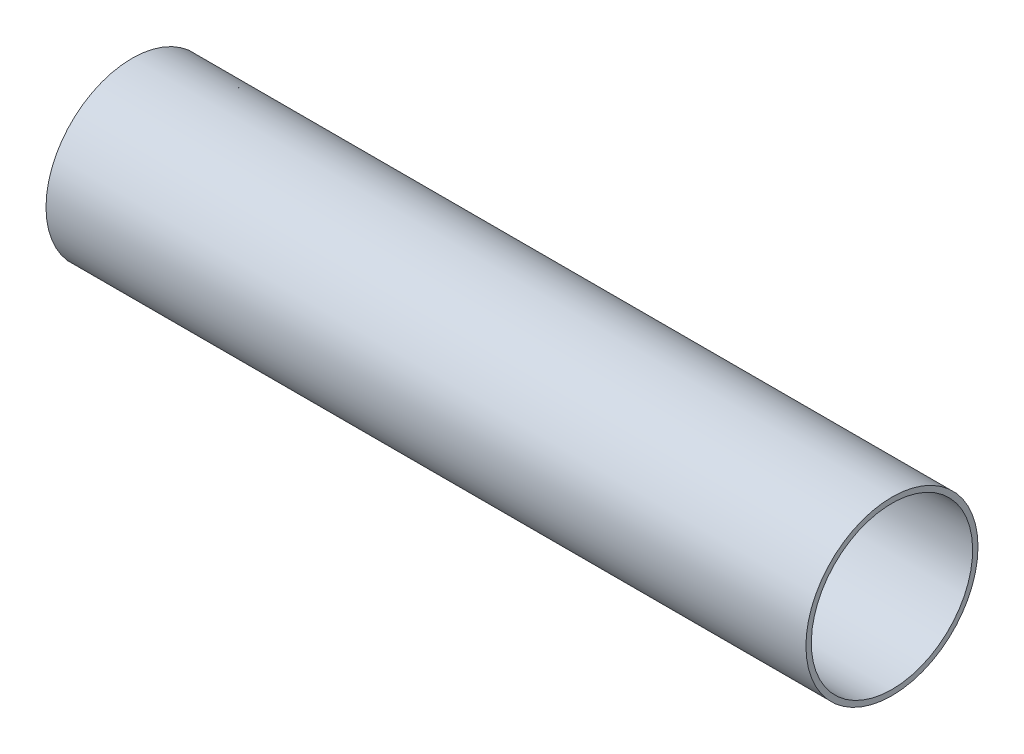
ISO-10303-21;
HEADER;
FILE_DESCRIPTION(('STEP AP214'),'2;1');
FILE_NAME('part.step','',(''),(''),'','','');
FILE_SCHEMA(('AUTOMOTIVE_DESIGN { 1 0 10303 214 1 1 1 1 }'));
ENDSEC;
DATA;
#1=APPLICATION_CONTEXT('core data for automotive mechanical design processes');
#2=APPLICATION_PROTOCOL_DEFINITION('international standard','automotive_design',2000,#1);
#3=PRODUCT_CONTEXT('',#1,'mechanical');
#4=PRODUCT('Part','Part','',(#3));
#5=PRODUCT_RELATED_PRODUCT_CATEGORY('part','',(#4));
#6=PRODUCT_DEFINITION_FORMATION('','',#4);
#7=PRODUCT_DEFINITION_CONTEXT('part definition',#1,'design');
#8=PRODUCT_DEFINITION('design','',#6,#7);
#9=PRODUCT_DEFINITION_SHAPE('','',#8);
#10=(LENGTH_UNIT() NAMED_UNIT(*) SI_UNIT(.MILLI.,.METRE.));
#11=(NAMED_UNIT(*) PLANE_ANGLE_UNIT() SI_UNIT($,.RADIAN.));
#12=(NAMED_UNIT(*) SI_UNIT($,.STERADIAN.) SOLID_ANGLE_UNIT());
#13=UNCERTAINTY_MEASURE_WITH_UNIT(LENGTH_MEASURE(1.E-05),#10,'distance_accuracy_value','');
#14=(GEOMETRIC_REPRESENTATION_CONTEXT(3) GLOBAL_UNCERTAINTY_ASSIGNED_CONTEXT((#13)) GLOBAL_UNIT_ASSIGNED_CONTEXT((#10,
#11,#12)) REPRESENTATION_CONTEXT('',''));
#15=CARTESIAN_POINT('',(0.,0.,0.));
#16=DIRECTION('',(0.,0.,1.));
#17=DIRECTION('',(1.,0.,0.));
#18=AXIS2_PLACEMENT_3D('',#15,#16,#17);
#19=CARTESIAN_POINT('',(167.4495,0.,0.));
#20=DIRECTION('',(-1.,0.,0.));
#21=DIRECTION('',(0.,0.,1.));
#22=AXIS2_PLACEMENT_3D('',#19,#20,#21);
#23=CYLINDRICAL_SURFACE('',#22,23.8125);
#24=CARTESIAN_POINT('',(112.17550009,0.,0.));
#25=DIRECTION('',(-1.,0.,0.));
#26=DIRECTION('',(0.,-1.,0.));
#27=AXIS2_PLACEMENT_3D('',#24,#25,#26);
#28=CIRCLE('',#27,23.8125);
#29=CARTESIAN_POINT('',(112.17550009,-23.8125,0.));
#30=VERTEX_POINT('',#29);
#31=EDGE_CURVE('E47',#30,#30,#28,.T.);
#32=ORIENTED_EDGE('',*,*,#31,.F.);
#33=EDGE_LOOP('',(#32));
#34=FACE_BOUND('',#33,.T.);
#35=CARTESIAN_POINT('',(-112.17550009,0.,0.));
#36=DIRECTION('',(1.,0.,0.));
#37=DIRECTION('',(0.,1.,0.));
#38=AXIS2_PLACEMENT_3D('',#35,#36,#37);
#39=CIRCLE('',#38,23.8125);
#40=CARTESIAN_POINT('',(-112.17550009,23.8125,0.));
#41=VERTEX_POINT('',#40);
#42=EDGE_CURVE('E51',#41,#41,#39,.T.);
#43=ORIENTED_EDGE('',*,*,#42,.F.);
#44=EDGE_LOOP('',(#43));
#45=FACE_BOUND('',#44,.T.);
#46=ADVANCED_FACE('F36',(#34,#45),#23,.F.);
#47=CARTESIAN_POINT('',(-112.17550009,-25.4,-25.4));
#48=DIRECTION('',(1.,0.,0.));
#49=DIRECTION('',(0.,1.,0.));
#50=AXIS2_PLACEMENT_3D('',#47,#48,#49);
#51=PLANE('',#50);
#52=ORIENTED_EDGE('',*,*,#42,.T.);
#53=EDGE_LOOP('',(#52));
#54=FACE_BOUND('',#53,.T.);
#55=CARTESIAN_POINT('',(-112.17550009,0.,0.));
#56=DIRECTION('',(1.,0.,0.));
#57=DIRECTION('',(0.,1.,0.));
#58=AXIS2_PLACEMENT_3D('',#55,#56,#57);
#59=CIRCLE('',#58,25.4);
#60=CARTESIAN_POINT('',(-112.17550009,25.4,0.));
#61=VERTEX_POINT('',#60);
#62=EDGE_CURVE('E10',#61,#61,#59,.T.);
#63=ORIENTED_EDGE('',*,*,#62,.F.);
#64=EDGE_LOOP('',(#63));
#65=FACE_BOUND('',#64,.T.);
#66=ADVANCED_FACE('F57',(#54,#65),#51,.F.);
#67=CARTESIAN_POINT('',(112.17550009,-25.4,-25.4));
#68=DIRECTION('',(-1.,0.,0.));
#69=DIRECTION('',(0.,-1.,0.));
#70=AXIS2_PLACEMENT_3D('',#67,#68,#69);
#71=PLANE('',#70);
#72=ORIENTED_EDGE('',*,*,#31,.T.);
#73=EDGE_LOOP('',(#72));
#74=FACE_BOUND('',#73,.T.);
#75=CARTESIAN_POINT('',(112.17550009,0.,0.));
#76=DIRECTION('',(-1.,0.,0.));
#77=DIRECTION('',(0.,-1.,0.));
#78=AXIS2_PLACEMENT_3D('',#75,#76,#77);
#79=CIRCLE('',#78,25.4);
#80=CARTESIAN_POINT('',(112.17550009,-25.4,0.));
#81=VERTEX_POINT('',#80);
#82=EDGE_CURVE('E43',#81,#81,#79,.T.);
#83=ORIENTED_EDGE('',*,*,#82,.F.);
#84=EDGE_LOOP('',(#83));
#85=FACE_BOUND('',#84,.T.);
#86=ADVANCED_FACE('F65',(#74,#85),#71,.F.);
#87=CARTESIAN_POINT('',(167.4495,0.,0.));
#88=DIRECTION('',(-1.,0.,0.));
#89=DIRECTION('',(0.,0.,1.));
#90=AXIS2_PLACEMENT_3D('',#87,#88,#89);
#91=CYLINDRICAL_SURFACE('',#90,25.4);
#92=ORIENTED_EDGE('',*,*,#82,.T.);
#93=EDGE_LOOP('',(#92));
#94=FACE_BOUND('',#93,.T.);
#95=ORIENTED_EDGE('',*,*,#62,.T.);
#96=EDGE_LOOP('',(#95));
#97=FACE_BOUND('',#96,.T.);
#98=ADVANCED_FACE('F38',(#94,#97),#91,.T.);
#99=CLOSED_SHELL('',(#46,#66,#86,#98));
#100=MANIFOLD_SOLID_BREP('B2',#99);
#101=ADVANCED_BREP_SHAPE_REPRESENTATION('',(#18,#100),#14);
#102=SHAPE_DEFINITION_REPRESENTATION(#9,#101);
ENDSEC;
END-ISO-10303-21;
